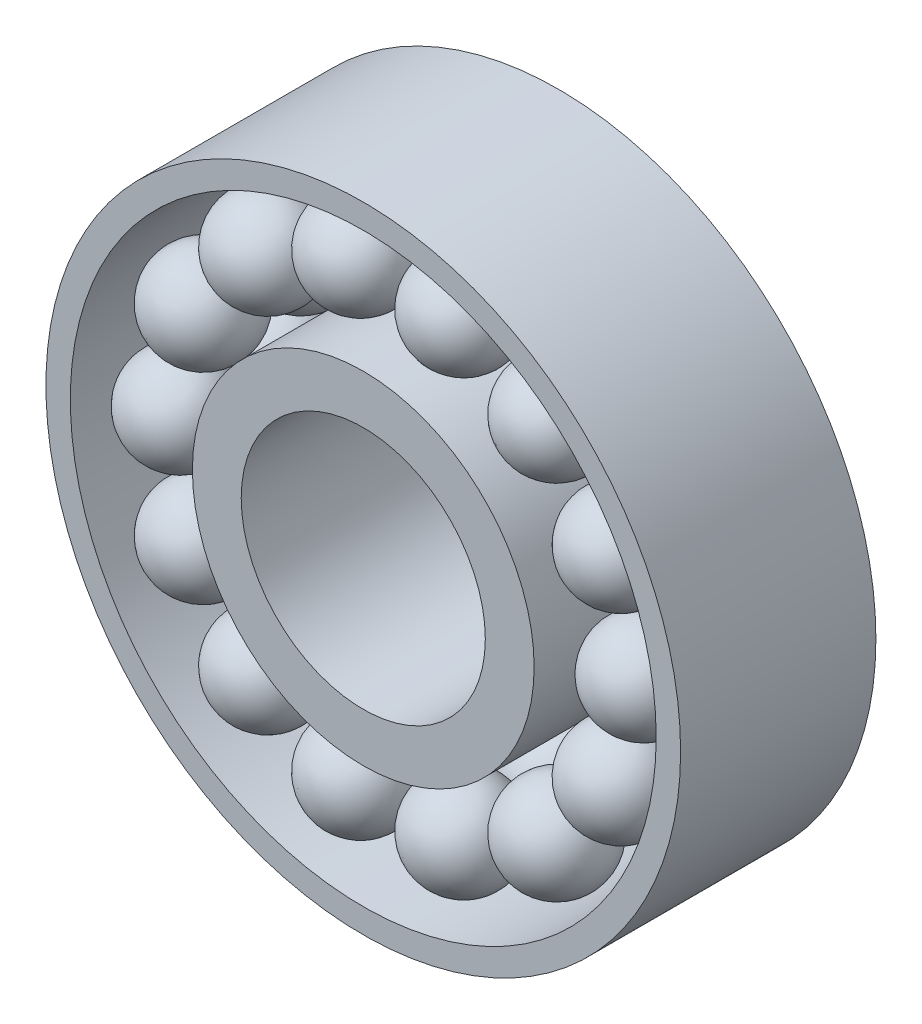
ISO-10303-21;
HEADER;
FILE_DESCRIPTION(('STEP AP214'),'2;1');
FILE_NAME('part.step','',(''),(''),'','','');
FILE_SCHEMA(('AUTOMOTIVE_DESIGN { 1 0 10303 214 1 1 1 1 }'));
ENDSEC;
DATA;
#1=APPLICATION_CONTEXT('core data for automotive mechanical design processes');
#2=APPLICATION_PROTOCOL_DEFINITION('international standard','automotive_design',2000,#1);
#3=PRODUCT_CONTEXT('',#1,'mechanical');
#4=PRODUCT('Part','Part','',(#3));
#5=PRODUCT_RELATED_PRODUCT_CATEGORY('part','',(#4));
#6=PRODUCT_DEFINITION_FORMATION('','',#4);
#7=PRODUCT_DEFINITION_CONTEXT('part definition',#1,'design');
#8=PRODUCT_DEFINITION('design','',#6,#7);
#9=PRODUCT_DEFINITION_SHAPE('','',#8);
#10=(LENGTH_UNIT() NAMED_UNIT(*) SI_UNIT(.MILLI.,.METRE.));
#11=(NAMED_UNIT(*) PLANE_ANGLE_UNIT() SI_UNIT($,.RADIAN.));
#12=(NAMED_UNIT(*) SI_UNIT($,.STERADIAN.) SOLID_ANGLE_UNIT());
#13=UNCERTAINTY_MEASURE_WITH_UNIT(LENGTH_MEASURE(1.E-05),#10,'distance_accuracy_value','');
#14=(GEOMETRIC_REPRESENTATION_CONTEXT(3) GLOBAL_UNCERTAINTY_ASSIGNED_CONTEXT((#13)) GLOBAL_UNIT_ASSIGNED_CONTEXT((#10,
#11,#12)) REPRESENTATION_CONTEXT('',''));
#15=CARTESIAN_POINT('',(0.,0.,0.));
#16=DIRECTION('',(0.,0.,1.));
#17=DIRECTION('',(1.,0.,0.));
#18=AXIS2_PLACEMENT_3D('',#15,#16,#17);
#19=CARTESIAN_POINT('',(9.50000034774506,0.,-2.));
#20=DIRECTION('',(0.,0.,1.));
#21=DIRECTION('',(-1.,0.,0.));
#22=AXIS2_PLACEMENT_3D('',#19,#20,#21);
#23=SPHERICAL_SURFACE('',#22,2.);
#24=CARTESIAN_POINT('',(9.50000034774506,0.,0.));
#25=VERTEX_POINT('',#24);
#26=VERTEX_LOOP('',#25);
#27=FACE_BOUND('',#26,.T.);
#28=ADVANCED_FACE('P0_F33',(#27),#23,.T.);
#29=CLOSED_SHELL('',(#28));
#30=MANIFOLD_SOLID_BREP('P0_B2',#29);
#31=CARTESIAN_POINT('',(0.,0.,-8.));
#32=DIRECTION('',(0.,0.,1.));
#33=DIRECTION('',(1.,0.,0.));
#34=AXIS2_PLACEMENT_3D('',#31,#32,#33);
#35=PLANE('',#34);
#36=CARTESIAN_POINT('',(0.,0.,-8.));
#37=DIRECTION('',(0.,0.,1.));
#38=DIRECTION('',(1.,0.,0.));
#39=AXIS2_PLACEMENT_3D('',#36,#37,#38);
#40=CIRCLE('',#39,5.);
#41=CARTESIAN_POINT('',(5.,0.,-8.));
#42=VERTEX_POINT('',#41);
#43=EDGE_CURVE('P1_E12',#42,#42,#40,.T.);
#44=ORIENTED_EDGE('',*,*,#43,.T.);
#45=EDGE_LOOP('',(#44));
#46=FACE_BOUND('',#45,.T.);
#47=CARTESIAN_POINT('',(0.,0.,-8.));
#48=DIRECTION('',(0.,0.,1.));
#49=DIRECTION('',(1.,0.,0.));
#50=AXIS2_PLACEMENT_3D('',#47,#48,#49);
#51=CIRCLE('',#50,7.);
#52=CARTESIAN_POINT('',(7.,0.,-8.));
#53=VERTEX_POINT('',#52);
#54=EDGE_CURVE('P1_E55',#53,#53,#51,.T.);
#55=ORIENTED_EDGE('',*,*,#54,.F.);
#56=EDGE_LOOP('',(#55));
#57=FACE_BOUND('',#56,.T.);
#58=ADVANCED_FACE('P1_F19',(#46,#57),#35,.F.);
#59=CARTESIAN_POINT('',(0.,0.,0.));
#60=DIRECTION('',(0.,0.,1.));
#61=DIRECTION('',(1.,0.,0.));
#62=AXIS2_PLACEMENT_3D('',#59,#60,#61);
#63=PLANE('',#62);
#64=CARTESIAN_POINT('',(0.,0.,0.));
#65=DIRECTION('',(0.,0.,1.));
#66=DIRECTION('',(1.,0.,0.));
#67=AXIS2_PLACEMENT_3D('',#64,#65,#66);
#68=CIRCLE('',#67,5.);
#69=CARTESIAN_POINT('',(5.,0.,0.));
#70=VERTEX_POINT('',#69);
#71=EDGE_CURVE('P1_E23',#70,#70,#68,.T.);
#72=ORIENTED_EDGE('',*,*,#71,.F.);
#73=EDGE_LOOP('',(#72));
#74=FACE_BOUND('',#73,.T.);
#75=CARTESIAN_POINT('',(0.,0.,0.));
#76=DIRECTION('',(0.,0.,1.));
#77=DIRECTION('',(1.,0.,0.));
#78=AXIS2_PLACEMENT_3D('',#75,#76,#77);
#79=CIRCLE('',#78,7.);
#80=CARTESIAN_POINT('',(7.,0.,0.));
#81=VERTEX_POINT('',#80);
#82=EDGE_CURVE('P1_E48',#81,#81,#79,.T.);
#83=ORIENTED_EDGE('',*,*,#82,.T.);
#84=EDGE_LOOP('',(#83));
#85=FACE_BOUND('',#84,.T.);
#86=ADVANCED_FACE('P1_F107',(#74,#85),#63,.T.);
#87=CARTESIAN_POINT('',(0.,0.,0.));
#88=DIRECTION('',(0.,0.,-1.));
#89=DIRECTION('',(-1.,0.,0.));
#90=AXIS2_PLACEMENT_3D('',#87,#88,#89);
#91=CYLINDRICAL_SURFACE('',#90,5.);
#92=ORIENTED_EDGE('',*,*,#43,.F.);
#93=EDGE_LOOP('',(#92));
#94=FACE_BOUND('',#93,.T.);
#95=ORIENTED_EDGE('',*,*,#71,.T.);
#96=EDGE_LOOP('',(#95));
#97=FACE_BOUND('',#96,.T.);
#98=ADVANCED_FACE('P1_F21',(#94,#97),#91,.F.);
#99=CARTESIAN_POINT('',(0.,0.,0.));
#100=DIRECTION('',(0.,0.,-1.));
#101=DIRECTION('',(-1.,0.,0.));
#102=AXIS2_PLACEMENT_3D('',#99,#100,#101);
#103=CYLINDRICAL_SURFACE('',#102,7.);
#104=ORIENTED_EDGE('',*,*,#54,.T.);
#105=EDGE_LOOP('',(#104));
#106=FACE_BOUND('',#105,.T.);
#107=ORIENTED_EDGE('',*,*,#82,.F.);
#108=EDGE_LOOP('',(#107));
#109=FACE_BOUND('',#108,.T.);
#110=ADVANCED_FACE('P1_F56',(#106,#109),#103,.T.);
#111=CLOSED_SHELL('',(#58,#86,#98,#110));
#112=MANIFOLD_SOLID_BREP('P1_B1',#111);
#113=CARTESIAN_POINT('',(-9.50000034774505,0.,-6.));
#114=DIRECTION('',(-1.,0.,0.));
#115=DIRECTION('',(0.,0.,1.));
#116=AXIS2_PLACEMENT_3D('',#113,#114,#115);
#117=SPHERICAL_SURFACE('',#116,2.);
#118=CARTESIAN_POINT('',(-9.50000034774505,0.,-4.));
#119=VERTEX_POINT('',#118);
#120=VERTEX_LOOP('',#119);
#121=FACE_BOUND('',#120,.T.);
#122=ADVANCED_FACE('P2_F15',(#121),#117,.T.);
#123=CLOSED_SHELL('',(#122));
#124=MANIFOLD_SOLID_BREP('P2_B1',#123);
#125=CARTESIAN_POINT('',(-2.11394894996553,9.26181550475369,-2.));
#126=DIRECTION('',(-0.222520933956313,0.974927912181824,0.));
#127=DIRECTION('',(0.,0.,1.));
#128=AXIS2_PLACEMENT_3D('',#125,#126,#127);
#129=SPHERICAL_SURFACE('',#128,2.);
#130=CARTESIAN_POINT('',(-2.11394894996553,9.26181550475369,0.));
#131=VERTEX_POINT('',#130);
#132=VERTEX_LOOP('',#131);
#133=FACE_BOUND('',#132,.T.);
#134=ADVANCED_FACE('P3_F15',(#133),#129,.T.);
#135=CLOSED_SHELL('',(#134));
#136=MANIFOLD_SOLID_BREP('P3_B1',#135);
#137=CARTESIAN_POINT('',(-8.55920455838044,4.12189567249775,-6.));
#138=DIRECTION('',(-0.900968867902418,0.43388373911756,0.));
#139=DIRECTION('',(0.,0.,1.));
#140=AXIS2_PLACEMENT_3D('',#137,#138,#139);
#141=SPHERICAL_SURFACE('',#140,2.);
#142=CARTESIAN_POINT('',(-8.55920455838044,4.12189567249775,-4.));
#143=VERTEX_POINT('',#142);
#144=VERTEX_LOOP('',#143);
#145=FACE_BOUND('',#144,.T.);
#146=ADVANCED_FACE('P4_F15',(#145),#141,.T.);
#147=CLOSED_SHELL('',(#146));
#148=MANIFOLD_SOLID_BREP('P4_B1',#147);
#149=CARTESIAN_POINT('',(-8.55920455838047,-4.1218956724977,-2.));
#150=DIRECTION('',(-0.90096886790242,-0.433883739117556,0.));
#151=DIRECTION('',(0.,0.,1.));
#152=AXIS2_PLACEMENT_3D('',#149,#150,#151);
#153=SPHERICAL_SURFACE('',#152,2.);
#154=CARTESIAN_POINT('',(-8.55920455838047,-4.1218956724977,0.));
#155=VERTEX_POINT('',#154);
#156=VERTEX_LOOP('',#155);
#157=FACE_BOUND('',#156,.T.);
#158=ADVANCED_FACE('P5_F15',(#157),#153,.T.);
#159=CLOSED_SHELL('',(#158));
#160=MANIFOLD_SOLID_BREP('P5_B1',#159);
#161=CARTESIAN_POINT('',(2.11394894996555,9.26181550475368,-2.));
#162=DIRECTION('',(0.222520933956315,0.974927912181824,0.));
#163=DIRECTION('',(0.,0.,1.));
#164=AXIS2_PLACEMENT_3D('',#161,#162,#163);
#165=SPHERICAL_SURFACE('',#164,2.);
#166=CARTESIAN_POINT('',(2.11394894996555,9.26181550475368,0.));
#167=VERTEX_POINT('',#166);
#168=VERTEX_LOOP('',#167);
#169=FACE_BOUND('',#168,.T.);
#170=ADVANCED_FACE('P6_F15',(#169),#165,.T.);
#171=CLOSED_SHELL('',(#170));
#172=MANIFOLD_SOLID_BREP('P6_B1',#171);
#173=CARTESIAN_POINT('',(-5.92315333447345,7.42739935532432,-6.));
#174=DIRECTION('',(-0.623489801858732,0.781831482468031,0.));
#175=DIRECTION('',(0.,0.,1.));
#176=AXIS2_PLACEMENT_3D('',#173,#174,#175);
#177=SPHERICAL_SURFACE('',#176,2.);
#178=CARTESIAN_POINT('',(-5.92315333447345,7.42739935532432,-4.));
#179=VERTEX_POINT('',#178);
#180=VERTEX_LOOP('',#179);
#181=FACE_BOUND('',#180,.T.);
#182=ADVANCED_FACE('P7_F15',(#181),#177,.T.);
#183=CLOSED_SHELL('',(#182));
#184=MANIFOLD_SOLID_BREP('P7_B1',#183);
#185=CARTESIAN_POINT('',(-5.92315333447348,-7.4273993553243,-6.));
#186=DIRECTION('',(-0.623489801858736,-0.781831482468028,0.));
#187=DIRECTION('',(0.,0.,1.));
#188=AXIS2_PLACEMENT_3D('',#185,#186,#187);
#189=SPHERICAL_SURFACE('',#188,2.);
#190=CARTESIAN_POINT('',(-5.92315333447348,-7.4273993553243,-4.));
#191=VERTEX_POINT('',#190);
#192=VERTEX_LOOP('',#191);
#193=FACE_BOUND('',#192,.T.);
#194=ADVANCED_FACE('P8_F15',(#193),#189,.T.);
#195=CLOSED_SHELL('',(#194));
#196=MANIFOLD_SOLID_BREP('P8_B1',#195);
#197=CARTESIAN_POINT('',(-2.11394894996557,-9.26181550475368,-6.));
#198=DIRECTION('',(-0.222520933956317,-0.974927912181823,0.));
#199=DIRECTION('',(0.,0.,1.));
#200=AXIS2_PLACEMENT_3D('',#197,#198,#199);
#201=SPHERICAL_SURFACE('',#200,2.);
#202=CARTESIAN_POINT('',(-2.11394894996557,-9.26181550475368,-4.));
#203=VERTEX_POINT('',#202);
#204=VERTEX_LOOP('',#203);
#205=FACE_BOUND('',#204,.T.);
#206=ADVANCED_FACE('P9_F15',(#205),#201,.T.);
#207=CLOSED_SHELL('',(#206));
#208=MANIFOLD_SOLID_BREP('P9_B1',#207);
#209=CARTESIAN_POINT('',(8.55920455838045,4.12189567249772,-2.));
#210=DIRECTION('',(0.900968867902419,0.433883739117558,0.));
#211=DIRECTION('',(0.,0.,1.));
#212=AXIS2_PLACEMENT_3D('',#209,#210,#211);
#213=SPHERICAL_SURFACE('',#212,2.);
#214=CARTESIAN_POINT('',(8.55920455838045,4.12189567249772,0.));
#215=VERTEX_POINT('',#214);
#216=VERTEX_LOOP('',#215);
#217=FACE_BOUND('',#216,.T.);
#218=ADVANCED_FACE('P10_F15',(#217),#213,.T.);
#219=CLOSED_SHELL('',(#218));
#220=MANIFOLD_SOLID_BREP('P10_B1',#219);
#221=CARTESIAN_POINT('',(5.92315333447347,7.42739935532431,-2.));
#222=DIRECTION('',(0.623489801858734,0.781831482468029,0.));
#223=DIRECTION('',(0.,0.,1.));
#224=AXIS2_PLACEMENT_3D('',#221,#222,#223);
#225=SPHERICAL_SURFACE('',#224,2.);
#226=CARTESIAN_POINT('',(5.92315333447347,7.42739935532431,0.));
#227=VERTEX_POINT('',#226);
#228=VERTEX_LOOP('',#227);
#229=FACE_BOUND('',#228,.T.);
#230=ADVANCED_FACE('P11_F15',(#229),#225,.T.);
#231=CLOSED_SHELL('',(#230));
#232=MANIFOLD_SOLID_BREP('P11_B1',#231);
#233=CARTESIAN_POINT('',(-2.11394894996553,9.26181550475368,-6.));
#234=DIRECTION('',(-0.222520933956313,0.974927912181824,0.));
#235=DIRECTION('',(0.,0.,1.));
#236=AXIS2_PLACEMENT_3D('',#233,#234,#235);
#237=SPHERICAL_SURFACE('',#236,2.);
#238=CARTESIAN_POINT('',(-2.11394894996553,9.26181550475368,-4.));
#239=VERTEX_POINT('',#238);
#240=VERTEX_LOOP('',#239);
#241=FACE_BOUND('',#240,.T.);
#242=ADVANCED_FACE('P12_F15',(#241),#237,.T.);
#243=CLOSED_SHELL('',(#242));
#244=MANIFOLD_SOLID_BREP('P12_B1',#243);
#245=CARTESIAN_POINT('',(-5.92315333447345,7.42739935532433,-2.));
#246=DIRECTION('',(-0.623489801858732,0.781831482468031,0.));
#247=DIRECTION('',(0.,0.,1.));
#248=AXIS2_PLACEMENT_3D('',#245,#246,#247);
#249=SPHERICAL_SURFACE('',#248,2.);
#250=CARTESIAN_POINT('',(-5.92315333447345,7.42739935532433,0.));
#251=VERTEX_POINT('',#250);
#252=VERTEX_LOOP('',#251);
#253=FACE_BOUND('',#252,.T.);
#254=ADVANCED_FACE('P13_F15',(#253),#249,.T.);
#255=CLOSED_SHELL('',(#254));
#256=MANIFOLD_SOLID_BREP('P13_B1',#255);
#257=CARTESIAN_POINT('',(8.55920455838043,-4.12189567249777,-6.));
#258=DIRECTION('',(0.900968867902417,-0.433883739117562,0.));
#259=DIRECTION('',(0.,0.,1.));
#260=AXIS2_PLACEMENT_3D('',#257,#258,#259);
#261=SPHERICAL_SURFACE('',#260,2.);
#262=CARTESIAN_POINT('',(8.55920455838043,-4.12189567249777,-4.));
#263=VERTEX_POINT('',#262);
#264=VERTEX_LOOP('',#263);
#265=FACE_BOUND('',#264,.T.);
#266=ADVANCED_FACE('P14_F15',(#265),#261,.T.);
#267=CLOSED_SHELL('',(#266));
#268=MANIFOLD_SOLID_BREP('P14_B1',#267);
#269=CARTESIAN_POINT('',(2.11394894996555,9.26181550475368,-6.));
#270=DIRECTION('',(0.222520933956316,0.974927912181823,0.));
#271=DIRECTION('',(0.,0.,1.));
#272=AXIS2_PLACEMENT_3D('',#269,#270,#271);
#273=SPHERICAL_SURFACE('',#272,2.);
#274=CARTESIAN_POINT('',(2.11394894996555,9.26181550475368,-4.));
#275=VERTEX_POINT('',#274);
#276=VERTEX_LOOP('',#275);
#277=FACE_BOUND('',#276,.T.);
#278=ADVANCED_FACE('P15_F15',(#277),#273,.T.);
#279=CLOSED_SHELL('',(#278));
#280=MANIFOLD_SOLID_BREP('P15_B1',#279);
#281=CARTESIAN_POINT('',(2.11394894996551,-9.2618155047537,-2.));
#282=DIRECTION('',(0.222520933956311,-0.974927912181824,0.));
#283=DIRECTION('',(0.,0.,1.));
#284=AXIS2_PLACEMENT_3D('',#281,#282,#283);
#285=SPHERICAL_SURFACE('',#284,2.);
#286=CARTESIAN_POINT('',(2.11394894996551,-9.2618155047537,0.));
#287=VERTEX_POINT('',#286);
#288=VERTEX_LOOP('',#287);
#289=FACE_BOUND('',#288,.T.);
#290=ADVANCED_FACE('P16_F15',(#289),#285,.T.);
#291=CLOSED_SHELL('',(#290));
#292=MANIFOLD_SOLID_BREP('P16_B1',#291);
#293=CARTESIAN_POINT('',(8.55920455838045,4.12189567249772,-6.));
#294=DIRECTION('',(0.900968867902419,0.433883739117558,0.));
#295=DIRECTION('',(0.,0.,1.));
#296=AXIS2_PLACEMENT_3D('',#293,#294,#295);
#297=SPHERICAL_SURFACE('',#296,2.);
#298=CARTESIAN_POINT('',(8.55920455838045,4.12189567249772,-4.));
#299=VERTEX_POINT('',#298);
#300=VERTEX_LOOP('',#299);
#301=FACE_BOUND('',#300,.T.);
#302=ADVANCED_FACE('P17_F15',(#301),#297,.T.);
#303=CLOSED_SHELL('',(#302));
#304=MANIFOLD_SOLID_BREP('P17_B1',#303);
#305=CARTESIAN_POINT('',(5.92315333447347,7.42739935532431,-6.));
#306=DIRECTION('',(0.623489801858734,0.781831482468029,0.));
#307=DIRECTION('',(0.,0.,1.));
#308=AXIS2_PLACEMENT_3D('',#305,#306,#307);
#309=SPHERICAL_SURFACE('',#308,2.);
#310=CARTESIAN_POINT('',(5.92315333447347,7.42739935532431,-4.));
#311=VERTEX_POINT('',#310);
#312=VERTEX_LOOP('',#311);
#313=FACE_BOUND('',#312,.T.);
#314=ADVANCED_FACE('P18_F15',(#313),#309,.T.);
#315=CLOSED_SHELL('',(#314));
#316=MANIFOLD_SOLID_BREP('P18_B1',#315);
#317=CARTESIAN_POINT('',(5.92315333447343,-7.42739935532435,-2.));
#318=DIRECTION('',(0.62348980185873,-0.781831482468033,0.));
#319=DIRECTION('',(0.,0.,1.));
#320=AXIS2_PLACEMENT_3D('',#317,#318,#319);
#321=SPHERICAL_SURFACE('',#320,2.);
#322=CARTESIAN_POINT('',(5.92315333447343,-7.42739935532435,0.));
#323=VERTEX_POINT('',#322);
#324=VERTEX_LOOP('',#323);
#325=FACE_BOUND('',#324,.T.);
#326=ADVANCED_FACE('P19_F15',(#325),#321,.T.);
#327=CLOSED_SHELL('',(#326));
#328=MANIFOLD_SOLID_BREP('P19_B1',#327);
#329=CARTESIAN_POINT('',(-2.11394894996557,-9.26181550475368,-2.));
#330=DIRECTION('',(-0.222520933956317,-0.974927912181823,0.));
#331=DIRECTION('',(0.,0.,1.));
#332=AXIS2_PLACEMENT_3D('',#329,#330,#331);
#333=SPHERICAL_SURFACE('',#332,2.);
#334=CARTESIAN_POINT('',(-2.11394894996557,-9.26181550475368,0.));
#335=VERTEX_POINT('',#334);
#336=VERTEX_LOOP('',#335);
#337=FACE_BOUND('',#336,.T.);
#338=ADVANCED_FACE('P20_F15',(#337),#333,.T.);
#339=CLOSED_SHELL('',(#338));
#340=MANIFOLD_SOLID_BREP('P20_B1',#339);
#341=CARTESIAN_POINT('',(2.11394894996551,-9.26181550475369,-6.));
#342=DIRECTION('',(0.222520933956311,-0.974927912181824,0.));
#343=DIRECTION('',(0.,0.,1.));
#344=AXIS2_PLACEMENT_3D('',#341,#342,#343);
#345=SPHERICAL_SURFACE('',#344,2.);
#346=CARTESIAN_POINT('',(2.11394894996551,-9.26181550475369,-4.));
#347=VERTEX_POINT('',#346);
#348=VERTEX_LOOP('',#347);
#349=FACE_BOUND('',#348,.T.);
#350=ADVANCED_FACE('P21_F15',(#349),#345,.T.);
#351=CLOSED_SHELL('',(#350));
#352=MANIFOLD_SOLID_BREP('P21_B1',#351);
#353=CARTESIAN_POINT('',(-8.55920455838046,-4.1218956724977,-6.));
#354=DIRECTION('',(-0.90096886790242,-0.433883739117556,0.));
#355=DIRECTION('',(0.,0.,1.));
#356=AXIS2_PLACEMENT_3D('',#353,#354,#355);
#357=SPHERICAL_SURFACE('',#356,2.);
#358=CARTESIAN_POINT('',(-8.55920455838046,-4.1218956724977,-4.));
#359=VERTEX_POINT('',#358);
#360=VERTEX_LOOP('',#359);
#361=FACE_BOUND('',#360,.T.);
#362=ADVANCED_FACE('P22_F15',(#361),#357,.T.);
#363=CLOSED_SHELL('',(#362));
#364=MANIFOLD_SOLID_BREP('P22_B1',#363);
#365=CARTESIAN_POINT('',(-9.50000034774506,0.,-2.));
#366=DIRECTION('',(-1.,0.,0.));
#367=DIRECTION('',(0.,0.,1.));
#368=AXIS2_PLACEMENT_3D('',#365,#366,#367);
#369=SPHERICAL_SURFACE('',#368,2.);
#370=CARTESIAN_POINT('',(-9.50000034774506,0.,0.));
#371=VERTEX_POINT('',#370);
#372=VERTEX_LOOP('',#371);
#373=FACE_BOUND('',#372,.T.);
#374=ADVANCED_FACE('P23_F14',(#373),#369,.T.);
#375=CLOSED_SHELL('',(#374));
#376=MANIFOLD_SOLID_BREP('P23_B1',#375);
#377=CARTESIAN_POINT('',(-8.55920455838045,4.12189567249775,-2.));
#378=DIRECTION('',(-0.900968867902418,0.43388373911756,0.));
#379=DIRECTION('',(0.,0.,1.));
#380=AXIS2_PLACEMENT_3D('',#377,#378,#379);
#381=SPHERICAL_SURFACE('',#380,2.);
#382=CARTESIAN_POINT('',(-8.55920455838045,4.12189567249775,0.));
#383=VERTEX_POINT('',#382);
#384=VERTEX_LOOP('',#383);
#385=FACE_BOUND('',#384,.T.);
#386=ADVANCED_FACE('P24_F15',(#385),#381,.T.);
#387=CLOSED_SHELL('',(#386));
#388=MANIFOLD_SOLID_BREP('P24_B1',#387);
#389=CARTESIAN_POINT('',(9.50000034774505,0.,-6.));
#390=DIRECTION('',(1.,0.,0.));
#391=DIRECTION('',(0.,0.,1.));
#392=AXIS2_PLACEMENT_3D('',#389,#390,#391);
#393=SPHERICAL_SURFACE('',#392,2.);
#394=CARTESIAN_POINT('',(9.50000034774505,0.,-4.));
#395=VERTEX_POINT('',#394);
#396=VERTEX_LOOP('',#395);
#397=FACE_BOUND('',#396,.T.);
#398=ADVANCED_FACE('P25_F15',(#397),#393,.T.);
#399=CLOSED_SHELL('',(#398));
#400=MANIFOLD_SOLID_BREP('P25_B1',#399);
#401=CARTESIAN_POINT('',(8.55920455838043,-4.12189567249777,-2.));
#402=DIRECTION('',(0.900968867902417,-0.433883739117562,0.));
#403=DIRECTION('',(0.,0.,1.));
#404=AXIS2_PLACEMENT_3D('',#401,#402,#403);
#405=SPHERICAL_SURFACE('',#404,2.);
#406=CARTESIAN_POINT('',(8.55920455838043,-4.12189567249777,0.));
#407=VERTEX_POINT('',#406);
#408=VERTEX_LOOP('',#407);
#409=FACE_BOUND('',#408,.T.);
#410=ADVANCED_FACE('P26_F15',(#409),#405,.T.);
#411=CLOSED_SHELL('',(#410));
#412=MANIFOLD_SOLID_BREP('P26_B1',#411);
#413=CARTESIAN_POINT('',(-5.92315333447349,-7.42739935532431,-2.));
#414=DIRECTION('',(-0.623489801858736,-0.781831482468028,0.));
#415=DIRECTION('',(0.,0.,1.));
#416=AXIS2_PLACEMENT_3D('',#413,#414,#415);
#417=SPHERICAL_SURFACE('',#416,2.);
#418=CARTESIAN_POINT('',(-5.92315333447349,-7.42739935532431,0.));
#419=VERTEX_POINT('',#418);
#420=VERTEX_LOOP('',#419);
#421=FACE_BOUND('',#420,.T.);
#422=ADVANCED_FACE('P27_F15',(#421),#417,.T.);
#423=CLOSED_SHELL('',(#422));
#424=MANIFOLD_SOLID_BREP('P27_B1',#423);
#425=CARTESIAN_POINT('',(5.92315333447343,-7.42739935532434,-6.));
#426=DIRECTION('',(0.62348980185873,-0.781831482468033,0.));
#427=DIRECTION('',(0.,0.,1.));
#428=AXIS2_PLACEMENT_3D('',#425,#426,#427);
#429=SPHERICAL_SURFACE('',#428,2.);
#430=CARTESIAN_POINT('',(5.92315333447343,-7.42739935532434,-4.));
#431=VERTEX_POINT('',#430);
#432=VERTEX_LOOP('',#431);
#433=FACE_BOUND('',#432,.T.);
#434=ADVANCED_FACE('P28_F15',(#433),#429,.T.);
#435=CLOSED_SHELL('',(#434));
#436=MANIFOLD_SOLID_BREP('P28_B1',#435);
#437=CARTESIAN_POINT('',(0.,0.,-8.));
#438=DIRECTION('',(0.,0.,1.));
#439=DIRECTION('',(1.,0.,0.));
#440=AXIS2_PLACEMENT_3D('',#437,#438,#439);
#441=PLANE('',#440);
#442=CARTESIAN_POINT('',(0.,0.,-8.));
#443=DIRECTION('',(0.,0.,1.));
#444=DIRECTION('',(1.,0.,0.));
#445=AXIS2_PLACEMENT_3D('',#442,#443,#444);
#446=CIRCLE('',#445,12.);
#447=CARTESIAN_POINT('',(12.,0.,-8.));
#448=VERTEX_POINT('',#447);
#449=EDGE_CURVE('P29_E12',#448,#448,#446,.T.);
#450=ORIENTED_EDGE('',*,*,#449,.T.);
#451=EDGE_LOOP('',(#450));
#452=FACE_BOUND('',#451,.T.);
#453=CARTESIAN_POINT('',(0.,0.,-8.));
#454=DIRECTION('',(0.,0.,1.));
#455=DIRECTION('',(1.,0.,0.));
#456=AXIS2_PLACEMENT_3D('',#453,#454,#455);
#457=CIRCLE('',#456,13.);
#458=CARTESIAN_POINT('',(13.,0.,-8.));
#459=VERTEX_POINT('',#458);
#460=EDGE_CURVE('P29_E24',#459,#459,#457,.T.);
#461=ORIENTED_EDGE('',*,*,#460,.F.);
#462=EDGE_LOOP('',(#461));
#463=FACE_BOUND('',#462,.T.);
#464=ADVANCED_FACE('P29_F20',(#452,#463),#441,.F.);
#465=CARTESIAN_POINT('',(0.,0.,0.));
#466=DIRECTION('',(0.,0.,1.));
#467=DIRECTION('',(1.,0.,0.));
#468=AXIS2_PLACEMENT_3D('',#465,#466,#467);
#469=PLANE('',#468);
#470=CARTESIAN_POINT('',(0.,0.,0.));
#471=DIRECTION('',(0.,0.,1.));
#472=DIRECTION('',(1.,0.,0.));
#473=AXIS2_PLACEMENT_3D('',#470,#471,#472);
#474=CIRCLE('',#473,12.);
#475=CARTESIAN_POINT('',(12.,0.,0.));
#476=VERTEX_POINT('',#475);
#477=EDGE_CURVE('P29_E32',#476,#476,#474,.T.);
#478=ORIENTED_EDGE('',*,*,#477,.F.);
#479=EDGE_LOOP('',(#478));
#480=FACE_BOUND('',#479,.T.);
#481=CARTESIAN_POINT('',(0.,0.,0.));
#482=DIRECTION('',(0.,0.,1.));
#483=DIRECTION('',(1.,0.,0.));
#484=AXIS2_PLACEMENT_3D('',#481,#482,#483);
#485=CIRCLE('',#484,13.);
#486=CARTESIAN_POINT('',(13.,0.,0.));
#487=VERTEX_POINT('',#486);
#488=EDGE_CURVE('P29_E52',#487,#487,#485,.T.);
#489=ORIENTED_EDGE('',*,*,#488,.T.);
#490=EDGE_LOOP('',(#489));
#491=FACE_BOUND('',#490,.T.);
#492=ADVANCED_FACE('P29_F109',(#480,#491),#469,.T.);
#493=CARTESIAN_POINT('',(0.,0.,0.));
#494=DIRECTION('',(0.,0.,-1.));
#495=DIRECTION('',(-1.,0.,0.));
#496=AXIS2_PLACEMENT_3D('',#493,#494,#495);
#497=CYLINDRICAL_SURFACE('',#496,12.);
#498=ORIENTED_EDGE('',*,*,#449,.F.);
#499=EDGE_LOOP('',(#498));
#500=FACE_BOUND('',#499,.T.);
#501=ORIENTED_EDGE('',*,*,#477,.T.);
#502=EDGE_LOOP('',(#501));
#503=FACE_BOUND('',#502,.T.);
#504=ADVANCED_FACE('P29_F22',(#500,#503),#497,.F.);
#505=CARTESIAN_POINT('',(0.,0.,0.));
#506=DIRECTION('',(0.,0.,-1.));
#507=DIRECTION('',(-1.,0.,0.));
#508=AXIS2_PLACEMENT_3D('',#505,#506,#507);
#509=CYLINDRICAL_SURFACE('',#508,13.);
#510=ORIENTED_EDGE('',*,*,#460,.T.);
#511=EDGE_LOOP('',(#510));
#512=FACE_BOUND('',#511,.T.);
#513=ORIENTED_EDGE('',*,*,#488,.F.);
#514=EDGE_LOOP('',(#513));
#515=FACE_BOUND('',#514,.T.);
#516=ADVANCED_FACE('P29_F58',(#512,#515),#509,.T.);
#517=CLOSED_SHELL('',(#464,#492,#504,#516));
#518=MANIFOLD_SOLID_BREP('P29_B1',#517);
#519=ADVANCED_BREP_SHAPE_REPRESENTATION('',(#18,#30,#112,#124,#136,#148,#160,#172,#184,#196,
#208,#220,#232,#244,#256,#268,#280,#292,#304,#316,#328,#340,#352,#364,#376,#388,#400,#412,#424,
#436,#518),#14);
#520=SHAPE_DEFINITION_REPRESENTATION(#9,#519);
ENDSEC;
END-ISO-10303-21;
